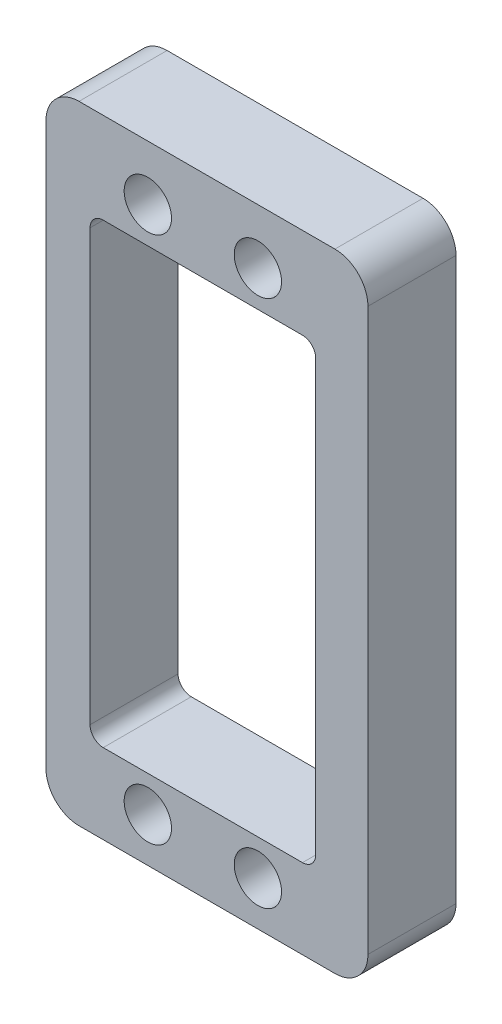
ISO-10303-21;
HEADER;
FILE_DESCRIPTION(('STEP AP214'),'2;1');
FILE_NAME('part.step','',(''),(''),'','','');
FILE_SCHEMA(('AUTOMOTIVE_DESIGN { 1 0 10303 214 1 1 1 1 }'));
ENDSEC;
DATA;
#1=APPLICATION_CONTEXT('core data for automotive mechanical design processes');
#2=APPLICATION_PROTOCOL_DEFINITION('international standard','automotive_design',2000,#1);
#3=PRODUCT_CONTEXT('',#1,'mechanical');
#4=PRODUCT('Part','Part','',(#3));
#5=PRODUCT_RELATED_PRODUCT_CATEGORY('part','',(#4));
#6=PRODUCT_DEFINITION_FORMATION('','',#4);
#7=PRODUCT_DEFINITION_CONTEXT('part definition',#1,'design');
#8=PRODUCT_DEFINITION('design','',#6,#7);
#9=PRODUCT_DEFINITION_SHAPE('','',#8);
#10=(LENGTH_UNIT() NAMED_UNIT(*) SI_UNIT(.MILLI.,.METRE.));
#11=(NAMED_UNIT(*) PLANE_ANGLE_UNIT() SI_UNIT($,.RADIAN.));
#12=(NAMED_UNIT(*) SI_UNIT($,.STERADIAN.) SOLID_ANGLE_UNIT());
#13=UNCERTAINTY_MEASURE_WITH_UNIT(LENGTH_MEASURE(1.E-05),#10,'distance_accuracy_value','');
#14=(GEOMETRIC_REPRESENTATION_CONTEXT(3) GLOBAL_UNCERTAINTY_ASSIGNED_CONTEXT((#13)) GLOBAL_UNIT_ASSIGNED_CONTEXT((#10,
#11,#12)) REPRESENTATION_CONTEXT('',''));
#15=CARTESIAN_POINT('',(0.,0.,0.));
#16=DIRECTION('',(0.,0.,1.));
#17=DIRECTION('',(1.,0.,0.));
#18=AXIS2_PLACEMENT_3D('',#15,#16,#17);
#19=CARTESIAN_POINT('',(0.,0.,8.));
#20=DIRECTION('',(0.,0.,1.));
#21=DIRECTION('',(1.,0.,0.));
#22=AXIS2_PLACEMENT_3D('',#19,#20,#21);
#23=PLANE('',#22);
#24=CARTESIAN_POINT('',(80.0000000000001,-4.99999999999999,8.));
#25=DIRECTION('',(0.,0.,1.));
#26=DIRECTION('',(1.,0.,0.));
#27=AXIS2_PLACEMENT_3D('',#24,#25,#26);
#28=CIRCLE('',#27,2.15);
#29=CARTESIAN_POINT('',(82.1500000000001,-4.99999999999999,8.));
#30=VERTEX_POINT('',#29);
#31=EDGE_CURVE('E202',#30,#30,#28,.T.);
#32=ORIENTED_EDGE('',*,*,#31,.F.);
#33=EDGE_LOOP('',(#32));
#34=FACE_BOUND('',#33,.T.);
#35=CARTESIAN_POINT('',(90.0000000000001,-53.,8.));
#36=DIRECTION('',(0.,0.,1.));
#37=DIRECTION('',(1.,0.,0.));
#38=AXIS2_PLACEMENT_3D('',#35,#36,#37);
#39=CIRCLE('',#38,2.15);
#40=CARTESIAN_POINT('',(92.15,-53.,8.));
#41=VERTEX_POINT('',#40);
#42=EDGE_CURVE('E190',#41,#41,#39,.T.);
#43=ORIENTED_EDGE('',*,*,#42,.F.);
#44=EDGE_LOOP('',(#43));
#45=FACE_BOUND('',#44,.T.);
#46=CARTESIAN_POINT('',(80.0000000000001,-53.,8.));
#47=DIRECTION('',(0.,0.,1.));
#48=DIRECTION('',(1.,0.,0.));
#49=AXIS2_PLACEMENT_3D('',#46,#47,#48);
#50=CIRCLE('',#49,2.15);
#51=CARTESIAN_POINT('',(82.1500000000001,-53.,8.));
#52=VERTEX_POINT('',#51);
#53=EDGE_CURVE('E206',#52,#52,#50,.T.);
#54=ORIENTED_EDGE('',*,*,#53,.F.);
#55=EDGE_LOOP('',(#54));
#56=FACE_BOUND('',#55,.T.);
#57=CARTESIAN_POINT('',(90.0000000000001,-4.99999999999999,8.));
#58=DIRECTION('',(0.,0.,1.));
#59=DIRECTION('',(1.,0.,0.));
#60=AXIS2_PLACEMENT_3D('',#57,#58,#59);
#61=CIRCLE('',#60,2.15);
#62=CARTESIAN_POINT('',(92.15,-4.99999999999999,8.));
#63=VERTEX_POINT('',#62);
#64=EDGE_CURVE('E199',#63,#63,#61,.T.);
#65=ORIENTED_EDGE('',*,*,#64,.F.);
#66=EDGE_LOOP('',(#65));
#67=FACE_BOUND('',#66,.T.);
#68=DIRECTION('',(1.,0.,0.));
#69=VECTOR('',#68,1.);
#70=CARTESIAN_POINT('',(74.7500000000001,-49.75,8.));
#71=LINE('',#70,#69);
#72=CARTESIAN_POINT('',(75.9500000000001,-49.75,8.));
#73=VERTEX_POINT('',#72);
#74=CARTESIAN_POINT('',(94.0500000000001,-49.75,8.));
#75=VERTEX_POINT('',#74);
#76=EDGE_CURVE('E327',#73,#75,#71,.T.);
#77=ORIENTED_EDGE('',*,*,#76,.F.);
#78=CARTESIAN_POINT('',(75.9500000000001,-48.55,8.));
#79=DIRECTION('',(0.,0.,1.));
#80=DIRECTION('',(1.,0.,0.));
#81=AXIS2_PLACEMENT_3D('',#78,#79,#80);
#82=CIRCLE('',#81,1.2);
#83=CARTESIAN_POINT('',(74.7500000000001,-48.55,8.));
#84=VERTEX_POINT('',#83);
#85=EDGE_CURVE('E185',#73,#84,#82,.F.);
#86=ORIENTED_EDGE('',*,*,#85,.T.);
#87=DIRECTION('',(0.,-1.,0.));
#88=VECTOR('',#87,1.);
#89=CARTESIAN_POINT('',(74.7500000000001,-8.24999999999999,8.));
#90=LINE('',#89,#88);
#91=CARTESIAN_POINT('',(74.7500000000001,-9.44999999999999,8.));
#92=VERTEX_POINT('',#91);
#93=EDGE_CURVE('E176',#92,#84,#90,.T.);
#94=ORIENTED_EDGE('',*,*,#93,.F.);
#95=CARTESIAN_POINT('',(75.9500000000001,-9.44999999999999,8.));
#96=DIRECTION('',(0.,0.,1.));
#97=DIRECTION('',(1.,0.,0.));
#98=AXIS2_PLACEMENT_3D('',#95,#96,#97);
#99=CIRCLE('',#98,1.2);
#100=CARTESIAN_POINT('',(75.9500000000001,-8.24999999999999,8.));
#101=VERTEX_POINT('',#100);
#102=EDGE_CURVE('E159',#92,#101,#99,.F.);
#103=ORIENTED_EDGE('',*,*,#102,.T.);
#104=DIRECTION('',(1.,0.,0.));
#105=VECTOR('',#104,1.);
#106=CARTESIAN_POINT('',(74.7500000000001,-8.24999999999999,8.));
#107=LINE('',#106,#105);
#108=CARTESIAN_POINT('',(94.0500000000001,-8.24999999999999,8.));
#109=VERTEX_POINT('',#108);
#110=EDGE_CURVE('E187',#101,#109,#107,.T.);
#111=ORIENTED_EDGE('',*,*,#110,.T.);
#112=CARTESIAN_POINT('',(94.0500000000001,-9.44999999999999,8.));
#113=DIRECTION('',(0.,0.,1.));
#114=DIRECTION('',(1.,0.,0.));
#115=AXIS2_PLACEMENT_3D('',#112,#113,#114);
#116=CIRCLE('',#115,1.2);
#117=CARTESIAN_POINT('',(95.2500000000001,-9.44999999999999,8.));
#118=VERTEX_POINT('',#117);
#119=EDGE_CURVE('E257',#109,#118,#116,.F.);
#120=ORIENTED_EDGE('',*,*,#119,.T.);
#121=DIRECTION('',(0.,-1.,0.));
#122=VECTOR('',#121,1.);
#123=CARTESIAN_POINT('',(95.2500000000001,-8.24999999999999,8.));
#124=LINE('',#123,#122);
#125=CARTESIAN_POINT('',(95.2500000000001,-48.55,8.));
#126=VERTEX_POINT('',#125);
#127=EDGE_CURVE('E192',#118,#126,#124,.T.);
#128=ORIENTED_EDGE('',*,*,#127,.T.);
#129=CARTESIAN_POINT('',(94.0500000000001,-48.55,8.));
#130=DIRECTION('',(0.,0.,1.));
#131=DIRECTION('',(1.,0.,0.));
#132=AXIS2_PLACEMENT_3D('',#129,#130,#131);
#133=CIRCLE('',#132,1.2);
#134=EDGE_CURVE('E250',#126,#75,#133,.F.);
#135=ORIENTED_EDGE('',*,*,#134,.T.);
#136=EDGE_LOOP('',(#77,#86,#94,#103,#111,#120,#128,#135));
#137=FACE_BOUND('',#136,.T.);
#138=DIRECTION('',(1.,0.,0.));
#139=VECTOR('',#138,1.);
#140=CARTESIAN_POINT('',(0.,-57.,8.));
#141=LINE('',#140,#139);
#142=CARTESIAN_POINT('',(73.7500000000001,-57.,8.));
#143=VERTEX_POINT('',#142);
#144=CARTESIAN_POINT('',(97.,-57.,8.));
#145=VERTEX_POINT('',#144);
#146=EDGE_CURVE('E305',#143,#145,#141,.T.);
#147=ORIENTED_EDGE('',*,*,#146,.T.);
#148=CARTESIAN_POINT('',(97.,-54.,8.));
#149=DIRECTION('',(0.,0.,1.));
#150=DIRECTION('',(1.,0.,0.));
#151=AXIS2_PLACEMENT_3D('',#148,#149,#150);
#152=CIRCLE('',#151,3.);
#153=CARTESIAN_POINT('',(100.,-54.,8.));
#154=VERTEX_POINT('',#153);
#155=EDGE_CURVE('E290',#145,#154,#152,.T.);
#156=ORIENTED_EDGE('',*,*,#155,.T.);
#157=DIRECTION('',(0.,1.,0.));
#158=VECTOR('',#157,1.);
#159=CARTESIAN_POINT('',(100.,0.,8.));
#160=LINE('',#159,#158);
#161=CARTESIAN_POINT('',(100.,-3.,8.));
#162=VERTEX_POINT('',#161);
#163=EDGE_CURVE('E217',#154,#162,#160,.T.);
#164=ORIENTED_EDGE('',*,*,#163,.T.);
#165=CARTESIAN_POINT('',(97.,-3.,8.));
#166=DIRECTION('',(0.,0.,1.));
#167=DIRECTION('',(1.,0.,0.));
#168=AXIS2_PLACEMENT_3D('',#165,#166,#167);
#169=CIRCLE('',#168,3.);
#170=CARTESIAN_POINT('',(97.,0.,8.));
#171=VERTEX_POINT('',#170);
#172=EDGE_CURVE('E264',#162,#171,#169,.T.);
#173=ORIENTED_EDGE('',*,*,#172,.T.);
#174=DIRECTION('',(-1.,0.,0.));
#175=VECTOR('',#174,1.);
#176=CARTESIAN_POINT('',(0.,0.,8.));
#177=LINE('',#176,#175);
#178=CARTESIAN_POINT('',(73.7500000000001,0.,8.));
#179=VERTEX_POINT('',#178);
#180=EDGE_CURVE('E219',#171,#179,#177,.T.);
#181=ORIENTED_EDGE('',*,*,#180,.T.);
#182=CARTESIAN_POINT('',(73.7500000000001,-3.,8.));
#183=DIRECTION('',(0.,0.,1.));
#184=DIRECTION('',(1.,0.,0.));
#185=AXIS2_PLACEMENT_3D('',#182,#183,#184);
#186=CIRCLE('',#185,3.);
#187=CARTESIAN_POINT('',(70.75,-3.,8.));
#188=VERTEX_POINT('',#187);
#189=EDGE_CURVE('E261',#179,#188,#186,.T.);
#190=ORIENTED_EDGE('',*,*,#189,.T.);
#191=DIRECTION('',(0.,1.,0.));
#192=VECTOR('',#191,1.);
#193=CARTESIAN_POINT('',(70.75,0.,8.));
#194=LINE('',#193,#192);
#195=CARTESIAN_POINT('',(70.75,-54.,8.));
#196=VERTEX_POINT('',#195);
#197=EDGE_CURVE('E304',#196,#188,#194,.T.);
#198=ORIENTED_EDGE('',*,*,#197,.F.);
#199=CARTESIAN_POINT('',(73.7500000000001,-54.,8.));
#200=DIRECTION('',(0.,0.,1.));
#201=DIRECTION('',(1.,0.,0.));
#202=AXIS2_PLACEMENT_3D('',#199,#200,#201);
#203=CIRCLE('',#202,3.);
#204=EDGE_CURVE('E288',#196,#143,#203,.T.);
#205=ORIENTED_EDGE('',*,*,#204,.T.);
#206=EDGE_LOOP('',(#147,#156,#164,#173,#181,#190,#198,#205));
#207=FACE_BOUND('',#206,.T.);
#208=ADVANCED_FACE('F44',(#34,#45,#56,#67,#137,#207),#23,.T.);
#209=CARTESIAN_POINT('',(0.,0.,0.));
#210=DIRECTION('',(0.,0.,1.));
#211=DIRECTION('',(1.,0.,0.));
#212=AXIS2_PLACEMENT_3D('',#209,#210,#211);
#213=PLANE('',#212);
#214=CARTESIAN_POINT('',(80.0000000000001,-4.99999999999999,0.));
#215=DIRECTION('',(0.,0.,1.));
#216=DIRECTION('',(1.,0.,0.));
#217=AXIS2_PLACEMENT_3D('',#214,#215,#216);
#218=CIRCLE('',#217,2.15);
#219=CARTESIAN_POINT('',(82.1500000000001,-4.99999999999999,0.));
#220=VERTEX_POINT('',#219);
#221=EDGE_CURVE('E211',#220,#220,#218,.T.);
#222=ORIENTED_EDGE('',*,*,#221,.T.);
#223=EDGE_LOOP('',(#222));
#224=FACE_BOUND('',#223,.T.);
#225=CARTESIAN_POINT('',(90.0000000000001,-53.,0.));
#226=DIRECTION('',(0.,0.,1.));
#227=DIRECTION('',(1.,0.,0.));
#228=AXIS2_PLACEMENT_3D('',#225,#226,#227);
#229=CIRCLE('',#228,2.15);
#230=CARTESIAN_POINT('',(92.15,-53.,0.));
#231=VERTEX_POINT('',#230);
#232=EDGE_CURVE('E186',#231,#231,#229,.T.);
#233=ORIENTED_EDGE('',*,*,#232,.T.);
#234=EDGE_LOOP('',(#233));
#235=FACE_BOUND('',#234,.T.);
#236=CARTESIAN_POINT('',(80.0000000000001,-53.,0.));
#237=DIRECTION('',(0.,0.,1.));
#238=DIRECTION('',(1.,0.,0.));
#239=AXIS2_PLACEMENT_3D('',#236,#237,#238);
#240=CIRCLE('',#239,2.15);
#241=CARTESIAN_POINT('',(82.1500000000001,-53.,0.));
#242=VERTEX_POINT('',#241);
#243=EDGE_CURVE('E197',#242,#242,#240,.T.);
#244=ORIENTED_EDGE('',*,*,#243,.T.);
#245=EDGE_LOOP('',(#244));
#246=FACE_BOUND('',#245,.T.);
#247=CARTESIAN_POINT('',(90.0000000000001,-4.99999999999999,0.));
#248=DIRECTION('',(0.,0.,1.));
#249=DIRECTION('',(1.,0.,0.));
#250=AXIS2_PLACEMENT_3D('',#247,#248,#249);
#251=CIRCLE('',#250,2.15);
#252=CARTESIAN_POINT('',(92.15,-4.99999999999999,0.));
#253=VERTEX_POINT('',#252);
#254=EDGE_CURVE('E203',#253,#253,#251,.T.);
#255=ORIENTED_EDGE('',*,*,#254,.T.);
#256=EDGE_LOOP('',(#255));
#257=FACE_BOUND('',#256,.T.);
#258=DIRECTION('',(1.,0.,0.));
#259=VECTOR('',#258,1.);
#260=CARTESIAN_POINT('',(0.,-8.24999999999999,0.));
#261=LINE('',#260,#259);
#262=CARTESIAN_POINT('',(75.9500000000001,-8.24999999999999,0.));
#263=VERTEX_POINT('',#262);
#264=CARTESIAN_POINT('',(94.0500000000001,-8.24999999999999,0.));
#265=VERTEX_POINT('',#264);
#266=EDGE_CURVE('E229',#263,#265,#261,.T.);
#267=ORIENTED_EDGE('',*,*,#266,.F.);
#268=CARTESIAN_POINT('',(75.9500000000001,-9.44999999999999,0.));
#269=DIRECTION('',(0.,0.,1.));
#270=DIRECTION('',(1.,0.,0.));
#271=AXIS2_PLACEMENT_3D('',#268,#269,#270);
#272=CIRCLE('',#271,1.2);
#273=CARTESIAN_POINT('',(74.7500000000001,-9.44999999999999,0.));
#274=VERTEX_POINT('',#273);
#275=EDGE_CURVE('E169',#263,#274,#272,.T.);
#276=ORIENTED_EDGE('',*,*,#275,.T.);
#277=DIRECTION('',(0.,-1.,0.));
#278=VECTOR('',#277,1.);
#279=CARTESIAN_POINT('',(74.7500000000001,0.,0.));
#280=LINE('',#279,#278);
#281=CARTESIAN_POINT('',(74.7500000000001,-48.55,0.));
#282=VERTEX_POINT('',#281);
#283=EDGE_CURVE('E179',#274,#282,#280,.T.);
#284=ORIENTED_EDGE('',*,*,#283,.T.);
#285=CARTESIAN_POINT('',(75.9500000000001,-48.55,0.));
#286=DIRECTION('',(0.,0.,1.));
#287=DIRECTION('',(1.,0.,0.));
#288=AXIS2_PLACEMENT_3D('',#285,#286,#287);
#289=CIRCLE('',#288,1.2);
#290=CARTESIAN_POINT('',(75.9500000000001,-49.75,0.));
#291=VERTEX_POINT('',#290);
#292=EDGE_CURVE('E255',#282,#291,#289,.T.);
#293=ORIENTED_EDGE('',*,*,#292,.T.);
#294=DIRECTION('',(1.,0.,0.));
#295=VECTOR('',#294,1.);
#296=CARTESIAN_POINT('',(0.,-49.75,0.));
#297=LINE('',#296,#295);
#298=CARTESIAN_POINT('',(94.0500000000001,-49.75,0.));
#299=VERTEX_POINT('',#298);
#300=EDGE_CURVE('E233',#291,#299,#297,.T.);
#301=ORIENTED_EDGE('',*,*,#300,.T.);
#302=CARTESIAN_POINT('',(94.0500000000001,-48.55,0.));
#303=DIRECTION('',(0.,0.,1.));
#304=DIRECTION('',(1.,0.,0.));
#305=AXIS2_PLACEMENT_3D('',#302,#303,#304);
#306=CIRCLE('',#305,1.2);
#307=CARTESIAN_POINT('',(95.2500000000001,-48.55,0.));
#308=VERTEX_POINT('',#307);
#309=EDGE_CURVE('E252',#299,#308,#306,.T.);
#310=ORIENTED_EDGE('',*,*,#309,.T.);
#311=DIRECTION('',(0.,-1.,0.));
#312=VECTOR('',#311,1.);
#313=CARTESIAN_POINT('',(95.2500000000001,0.,0.));
#314=LINE('',#313,#312);
#315=CARTESIAN_POINT('',(95.2500000000001,-9.44999999999999,0.));
#316=VERTEX_POINT('',#315);
#317=EDGE_CURVE('E223',#316,#308,#314,.T.);
#318=ORIENTED_EDGE('',*,*,#317,.F.);
#319=CARTESIAN_POINT('',(94.0500000000001,-9.44999999999999,0.));
#320=DIRECTION('',(0.,0.,1.));
#321=DIRECTION('',(1.,0.,0.));
#322=AXIS2_PLACEMENT_3D('',#319,#320,#321);
#323=CIRCLE('',#322,1.2);
#324=EDGE_CURVE('E259',#316,#265,#323,.T.);
#325=ORIENTED_EDGE('',*,*,#324,.T.);
#326=EDGE_LOOP('',(#267,#276,#284,#293,#301,#310,#318,#325));
#327=FACE_BOUND('',#326,.T.);
#328=DIRECTION('',(0.,1.,0.));
#329=VECTOR('',#328,1.);
#330=CARTESIAN_POINT('',(100.,0.,0.));
#331=LINE('',#330,#329);
#332=CARTESIAN_POINT('',(100.,-54.,0.));
#333=VERTEX_POINT('',#332);
#334=CARTESIAN_POINT('',(100.,-3.,0.));
#335=VERTEX_POINT('',#334);
#336=EDGE_CURVE('E214',#333,#335,#331,.T.);
#337=ORIENTED_EDGE('',*,*,#336,.F.);
#338=CARTESIAN_POINT('',(97.,-54.,0.));
#339=DIRECTION('',(0.,0.,1.));
#340=DIRECTION('',(1.,0.,0.));
#341=AXIS2_PLACEMENT_3D('',#338,#339,#340);
#342=CIRCLE('',#341,3.);
#343=CARTESIAN_POINT('',(97.,-57.,0.));
#344=VERTEX_POINT('',#343);
#345=EDGE_CURVE('E52',#333,#344,#342,.F.);
#346=ORIENTED_EDGE('',*,*,#345,.T.);
#347=DIRECTION('',(1.,0.,0.));
#348=VECTOR('',#347,1.);
#349=CARTESIAN_POINT('',(0.,-57.,0.));
#350=LINE('',#349,#348);
#351=CARTESIAN_POINT('',(73.7500000000001,-57.,0.));
#352=VERTEX_POINT('',#351);
#353=EDGE_CURVE('E296',#352,#344,#350,.T.);
#354=ORIENTED_EDGE('',*,*,#353,.F.);
#355=CARTESIAN_POINT('',(73.7500000000001,-54.,0.));
#356=DIRECTION('',(0.,0.,1.));
#357=DIRECTION('',(1.,0.,0.));
#358=AXIS2_PLACEMENT_3D('',#355,#356,#357);
#359=CIRCLE('',#358,3.);
#360=CARTESIAN_POINT('',(70.75,-54.,0.));
#361=VERTEX_POINT('',#360);
#362=EDGE_CURVE('E59',#352,#361,#359,.F.);
#363=ORIENTED_EDGE('',*,*,#362,.T.);
#364=DIRECTION('',(0.,1.,0.));
#365=VECTOR('',#364,1.);
#366=CARTESIAN_POINT('',(70.75,0.,0.));
#367=LINE('',#366,#365);
#368=CARTESIAN_POINT('',(70.75,-3.,0.));
#369=VERTEX_POINT('',#368);
#370=EDGE_CURVE('E325',#361,#369,#367,.T.);
#371=ORIENTED_EDGE('',*,*,#370,.T.);
#372=CARTESIAN_POINT('',(73.7500000000001,-3.,0.));
#373=DIRECTION('',(0.,0.,1.));
#374=DIRECTION('',(1.,0.,0.));
#375=AXIS2_PLACEMENT_3D('',#372,#373,#374);
#376=CIRCLE('',#375,3.);
#377=CARTESIAN_POINT('',(73.7500000000001,0.,0.));
#378=VERTEX_POINT('',#377);
#379=EDGE_CURVE('E266',#369,#378,#376,.F.);
#380=ORIENTED_EDGE('',*,*,#379,.T.);
#381=DIRECTION('',(-1.,0.,0.));
#382=VECTOR('',#381,1.);
#383=CARTESIAN_POINT('',(0.,0.,0.));
#384=LINE('',#383,#382);
#385=CARTESIAN_POINT('',(97.,0.,0.));
#386=VERTEX_POINT('',#385);
#387=EDGE_CURVE('E220',#386,#378,#384,.T.);
#388=ORIENTED_EDGE('',*,*,#387,.F.);
#389=CARTESIAN_POINT('',(97.,-3.,0.));
#390=DIRECTION('',(0.,0.,1.));
#391=DIRECTION('',(1.,0.,0.));
#392=AXIS2_PLACEMENT_3D('',#389,#390,#391);
#393=CIRCLE('',#392,3.);
#394=EDGE_CURVE('E268',#386,#335,#393,.F.);
#395=ORIENTED_EDGE('',*,*,#394,.T.);
#396=EDGE_LOOP('',(#337,#346,#354,#363,#371,#380,#388,#395));
#397=FACE_BOUND('',#396,.T.);
#398=ADVANCED_FACE('F295',(#224,#235,#246,#257,#327,#397),#213,.F.);
#399=CARTESIAN_POINT('',(100.,0.,8.));
#400=DIRECTION('',(-1.,0.,0.));
#401=DIRECTION('',(0.,-1.,0.));
#402=AXIS2_PLACEMENT_3D('',#399,#400,#401);
#403=PLANE('',#402);
#404=ORIENTED_EDGE('',*,*,#163,.F.);
#405=DIRECTION('',(0.,0.,1.));
#406=VECTOR('',#405,1.);
#407=CARTESIAN_POINT('',(100.,-54.,0.));
#408=LINE('',#407,#406);
#409=EDGE_CURVE('E67',#154,#333,#408,.F.);
#410=ORIENTED_EDGE('',*,*,#409,.T.);
#411=ORIENTED_EDGE('',*,*,#336,.T.);
#412=DIRECTION('',(0.,0.,-1.));
#413=VECTOR('',#412,1.);
#414=CARTESIAN_POINT('',(100.,-3.,8.));
#415=LINE('',#414,#413);
#416=EDGE_CURVE('E271',#335,#162,#415,.F.);
#417=ORIENTED_EDGE('',*,*,#416,.T.);
#418=EDGE_LOOP('',(#404,#410,#411,#417));
#419=FACE_BOUND('',#418,.T.);
#420=ADVANCED_FACE('F308',(#419),#403,.F.);
#421=CARTESIAN_POINT('',(70.75,0.,0.));
#422=DIRECTION('',(1.,0.,0.));
#423=DIRECTION('',(0.,0.,-1.));
#424=AXIS2_PLACEMENT_3D('',#421,#422,#423);
#425=PLANE('',#424);
#426=ORIENTED_EDGE('',*,*,#370,.F.);
#427=DIRECTION('',(0.,0.,1.));
#428=VECTOR('',#427,1.);
#429=CARTESIAN_POINT('',(70.75,-54.,8.));
#430=LINE('',#429,#428);
#431=EDGE_CURVE('E11',#361,#196,#430,.T.);
#432=ORIENTED_EDGE('',*,*,#431,.T.);
#433=ORIENTED_EDGE('',*,*,#197,.T.);
#434=DIRECTION('',(0.,0.,1.));
#435=VECTOR('',#434,1.);
#436=CARTESIAN_POINT('',(70.75,-3.,0.));
#437=LINE('',#436,#435);
#438=EDGE_CURVE('E280',#188,#369,#437,.F.);
#439=ORIENTED_EDGE('',*,*,#438,.T.);
#440=EDGE_LOOP('',(#426,#432,#433,#439));
#441=FACE_BOUND('',#440,.T.);
#442=ADVANCED_FACE('F372',(#441),#425,.F.);
#443=CARTESIAN_POINT('',(0.,0.,8.));
#444=DIRECTION('',(0.,-1.,0.));
#445=DIRECTION('',(0.,0.,-1.));
#446=AXIS2_PLACEMENT_3D('',#443,#444,#445);
#447=PLANE('',#446);
#448=ORIENTED_EDGE('',*,*,#180,.F.);
#449=DIRECTION('',(0.,0.,-1.));
#450=VECTOR('',#449,1.);
#451=CARTESIAN_POINT('',(97.,0.,8.));
#452=LINE('',#451,#450);
#453=EDGE_CURVE('E277',#171,#386,#452,.T.);
#454=ORIENTED_EDGE('',*,*,#453,.T.);
#455=ORIENTED_EDGE('',*,*,#387,.T.);
#456=DIRECTION('',(0.,0.,1.));
#457=VECTOR('',#456,1.);
#458=CARTESIAN_POINT('',(73.7500000000001,0.,8.));
#459=LINE('',#458,#457);
#460=EDGE_CURVE('E274',#378,#179,#459,.T.);
#461=ORIENTED_EDGE('',*,*,#460,.T.);
#462=EDGE_LOOP('',(#448,#454,#455,#461));
#463=FACE_BOUND('',#462,.T.);
#464=ADVANCED_FACE('F316',(#463),#447,.F.);
#465=CARTESIAN_POINT('',(80.0000000000001,-4.99999999999999,0.));
#466=DIRECTION('',(0.,0.,1.));
#467=DIRECTION('',(1.,0.,0.));
#468=AXIS2_PLACEMENT_3D('',#465,#466,#467);
#469=CYLINDRICAL_SURFACE('',#468,2.15);
#470=ORIENTED_EDGE('',*,*,#221,.F.);
#471=EDGE_LOOP('',(#470));
#472=FACE_BOUND('',#471,.T.);
#473=ORIENTED_EDGE('',*,*,#31,.T.);
#474=EDGE_LOOP('',(#473));
#475=FACE_BOUND('',#474,.T.);
#476=ADVANCED_FACE('F367',(#472,#475),#469,.F.);
#477=CARTESIAN_POINT('',(90.0000000000001,-53.,0.));
#478=DIRECTION('',(0.,0.,1.));
#479=DIRECTION('',(1.,0.,0.));
#480=AXIS2_PLACEMENT_3D('',#477,#478,#479);
#481=CYLINDRICAL_SURFACE('',#480,2.15);
#482=ORIENTED_EDGE('',*,*,#232,.F.);
#483=EDGE_LOOP('',(#482));
#484=FACE_BOUND('',#483,.T.);
#485=ORIENTED_EDGE('',*,*,#42,.T.);
#486=EDGE_LOOP('',(#485));
#487=FACE_BOUND('',#486,.T.);
#488=ADVANCED_FACE('F418',(#484,#487),#481,.F.);
#489=CARTESIAN_POINT('',(80.0000000000001,-53.,0.));
#490=DIRECTION('',(0.,0.,1.));
#491=DIRECTION('',(1.,0.,0.));
#492=AXIS2_PLACEMENT_3D('',#489,#490,#491);
#493=CYLINDRICAL_SURFACE('',#492,2.15);
#494=ORIENTED_EDGE('',*,*,#243,.F.);
#495=EDGE_LOOP('',(#494));
#496=FACE_BOUND('',#495,.T.);
#497=ORIENTED_EDGE('',*,*,#53,.T.);
#498=EDGE_LOOP('',(#497));
#499=FACE_BOUND('',#498,.T.);
#500=ADVANCED_FACE('F425',(#496,#499),#493,.F.);
#501=CARTESIAN_POINT('',(90.0000000000001,-4.99999999999999,0.));
#502=DIRECTION('',(0.,0.,1.));
#503=DIRECTION('',(1.,0.,0.));
#504=AXIS2_PLACEMENT_3D('',#501,#502,#503);
#505=CYLINDRICAL_SURFACE('',#504,2.15);
#506=ORIENTED_EDGE('',*,*,#254,.F.);
#507=EDGE_LOOP('',(#506));
#508=FACE_BOUND('',#507,.T.);
#509=ORIENTED_EDGE('',*,*,#64,.T.);
#510=EDGE_LOOP('',(#509));
#511=FACE_BOUND('',#510,.T.);
#512=ADVANCED_FACE('F433',(#508,#511),#505,.F.);
#513=CARTESIAN_POINT('',(74.7500000000001,-49.75,-2.));
#514=DIRECTION('',(0.,-1.,0.));
#515=DIRECTION('',(0.,0.,-1.));
#516=AXIS2_PLACEMENT_3D('',#513,#514,#515);
#517=PLANE('',#516);
#518=ORIENTED_EDGE('',*,*,#76,.T.);
#519=DIRECTION('',(0.,0.,1.));
#520=VECTOR('',#519,1.);
#521=CARTESIAN_POINT('',(94.0500000000001,-49.75,-2.));
#522=LINE('',#521,#520);
#523=EDGE_CURVE('E170',#75,#299,#522,.F.);
#524=ORIENTED_EDGE('',*,*,#523,.T.);
#525=ORIENTED_EDGE('',*,*,#300,.F.);
#526=DIRECTION('',(0.,0.,1.));
#527=VECTOR('',#526,1.);
#528=CARTESIAN_POINT('',(75.9500000000001,-49.75,8.));
#529=LINE('',#528,#527);
#530=EDGE_CURVE('E245',#291,#73,#529,.T.);
#531=ORIENTED_EDGE('',*,*,#530,.T.);
#532=EDGE_LOOP('',(#518,#524,#525,#531));
#533=FACE_BOUND('',#532,.T.);
#534=ADVANCED_FACE('F354',(#533),#517,.F.);
#535=CARTESIAN_POINT('',(74.7500000000001,-8.24999999999999,-2.));
#536=DIRECTION('',(-1.,0.,0.));
#537=DIRECTION('',(0.,0.,1.));
#538=AXIS2_PLACEMENT_3D('',#535,#536,#537);
#539=PLANE('',#538);
#540=ORIENTED_EDGE('',*,*,#283,.F.);
#541=DIRECTION('',(0.,0.,1.));
#542=VECTOR('',#541,1.);
#543=CARTESIAN_POINT('',(74.7500000000001,-9.44999999999999,-2.));
#544=LINE('',#543,#542);
#545=EDGE_CURVE('E163',#274,#92,#544,.T.);
#546=ORIENTED_EDGE('',*,*,#545,.T.);
#547=ORIENTED_EDGE('',*,*,#93,.T.);
#548=DIRECTION('',(0.,0.,1.));
#549=VECTOR('',#548,1.);
#550=CARTESIAN_POINT('',(74.7500000000001,-48.55,0.));
#551=LINE('',#550,#549);
#552=EDGE_CURVE('E181',#84,#282,#551,.F.);
#553=ORIENTED_EDGE('',*,*,#552,.T.);
#554=EDGE_LOOP('',(#540,#546,#547,#553));
#555=FACE_BOUND('',#554,.T.);
#556=ADVANCED_FACE('F175',(#555),#539,.F.);
#557=CARTESIAN_POINT('',(74.7500000000001,-8.24999999999999,-2.));
#558=DIRECTION('',(0.,-1.,0.));
#559=DIRECTION('',(0.,0.,-1.));
#560=AXIS2_PLACEMENT_3D('',#557,#558,#559);
#561=PLANE('',#560);
#562=ORIENTED_EDGE('',*,*,#110,.F.);
#563=DIRECTION('',(0.,0.,1.));
#564=VECTOR('',#563,1.);
#565=CARTESIAN_POINT('',(75.9500000000001,-8.24999999999999,-2.));
#566=LINE('',#565,#564);
#567=EDGE_CURVE('E164',#101,#263,#566,.F.);
#568=ORIENTED_EDGE('',*,*,#567,.T.);
#569=ORIENTED_EDGE('',*,*,#266,.T.);
#570=DIRECTION('',(0.,0.,1.));
#571=VECTOR('',#570,1.);
#572=CARTESIAN_POINT('',(94.0500000000001,-8.24999999999999,8.));
#573=LINE('',#572,#571);
#574=EDGE_CURVE('E180',#265,#109,#573,.T.);
#575=ORIENTED_EDGE('',*,*,#574,.T.);
#576=EDGE_LOOP('',(#562,#568,#569,#575));
#577=FACE_BOUND('',#576,.T.);
#578=ADVANCED_FACE('F346',(#577),#561,.T.);
#579=CARTESIAN_POINT('',(95.2500000000001,-8.24999999999999,-2.));
#580=DIRECTION('',(-1.,0.,0.));
#581=DIRECTION('',(0.,0.,1.));
#582=AXIS2_PLACEMENT_3D('',#579,#580,#581);
#583=PLANE('',#582);
#584=ORIENTED_EDGE('',*,*,#317,.T.);
#585=DIRECTION('',(0.,0.,1.));
#586=VECTOR('',#585,1.);
#587=CARTESIAN_POINT('',(95.2500000000001,-48.55,-2.));
#588=LINE('',#587,#586);
#589=EDGE_CURVE('E242',#308,#126,#588,.T.);
#590=ORIENTED_EDGE('',*,*,#589,.T.);
#591=ORIENTED_EDGE('',*,*,#127,.F.);
#592=DIRECTION('',(0.,0.,1.));
#593=VECTOR('',#592,1.);
#594=CARTESIAN_POINT('',(95.2500000000001,-9.44999999999999,0.));
#595=LINE('',#594,#593);
#596=EDGE_CURVE('E240',#118,#316,#595,.F.);
#597=ORIENTED_EDGE('',*,*,#596,.T.);
#598=EDGE_LOOP('',(#584,#590,#591,#597));
#599=FACE_BOUND('',#598,.T.);
#600=ADVANCED_FACE('F336',(#599),#583,.T.);
#601=CARTESIAN_POINT('',(75.9500000000001,-9.44999999999999,-2.));
#602=DIRECTION('',(0.,0.,1.));
#603=DIRECTION('',(1.,0.,0.));
#604=AXIS2_PLACEMENT_3D('',#601,#602,#603);
#605=CYLINDRICAL_SURFACE('',#604,1.2);
#606=ORIENTED_EDGE('',*,*,#275,.F.);
#607=ORIENTED_EDGE('',*,*,#567,.F.);
#608=ORIENTED_EDGE('',*,*,#102,.F.);
#609=ORIENTED_EDGE('',*,*,#545,.F.);
#610=EDGE_LOOP('',(#606,#607,#608,#609));
#611=FACE_BOUND('',#610,.T.);
#612=ADVANCED_FACE('F162',(#611),#605,.F.);
#613=CARTESIAN_POINT('',(94.0500000000001,-48.55,-2.));
#614=DIRECTION('',(0.,0.,1.));
#615=DIRECTION('',(1.,0.,0.));
#616=AXIS2_PLACEMENT_3D('',#613,#614,#615);
#617=CYLINDRICAL_SURFACE('',#616,1.2);
#618=ORIENTED_EDGE('',*,*,#309,.F.);
#619=ORIENTED_EDGE('',*,*,#523,.F.);
#620=ORIENTED_EDGE('',*,*,#134,.F.);
#621=ORIENTED_EDGE('',*,*,#589,.F.);
#622=EDGE_LOOP('',(#618,#619,#620,#621));
#623=FACE_BOUND('',#622,.T.);
#624=ADVANCED_FACE('F377',(#623),#617,.F.);
#625=CARTESIAN_POINT('',(75.9500000000001,-48.55,-2.));
#626=DIRECTION('',(0.,0.,-1.));
#627=DIRECTION('',(-1.,0.,0.));
#628=AXIS2_PLACEMENT_3D('',#625,#626,#627);
#629=CYLINDRICAL_SURFACE('',#628,1.2);
#630=ORIENTED_EDGE('',*,*,#292,.F.);
#631=ORIENTED_EDGE('',*,*,#552,.F.);
#632=ORIENTED_EDGE('',*,*,#85,.F.);
#633=ORIENTED_EDGE('',*,*,#530,.F.);
#634=EDGE_LOOP('',(#630,#631,#632,#633));
#635=FACE_BOUND('',#634,.T.);
#636=ADVANCED_FACE('F380',(#635),#629,.F.);
#637=CARTESIAN_POINT('',(94.0500000000001,-9.44999999999999,-2.));
#638=DIRECTION('',(0.,0.,-1.));
#639=DIRECTION('',(-1.,0.,0.));
#640=AXIS2_PLACEMENT_3D('',#637,#638,#639);
#641=CYLINDRICAL_SURFACE('',#640,1.2);
#642=ORIENTED_EDGE('',*,*,#324,.F.);
#643=ORIENTED_EDGE('',*,*,#596,.F.);
#644=ORIENTED_EDGE('',*,*,#119,.F.);
#645=ORIENTED_EDGE('',*,*,#574,.F.);
#646=EDGE_LOOP('',(#642,#643,#644,#645));
#647=FACE_BOUND('',#646,.T.);
#648=ADVANCED_FACE('F341',(#647),#641,.F.);
#649=CARTESIAN_POINT('',(97.,-3.,8.));
#650=DIRECTION('',(0.,0.,-1.));
#651=DIRECTION('',(-1.,0.,0.));
#652=AXIS2_PLACEMENT_3D('',#649,#650,#651);
#653=CYLINDRICAL_SURFACE('',#652,3.);
#654=ORIENTED_EDGE('',*,*,#172,.F.);
#655=ORIENTED_EDGE('',*,*,#416,.F.);
#656=ORIENTED_EDGE('',*,*,#394,.F.);
#657=ORIENTED_EDGE('',*,*,#453,.F.);
#658=EDGE_LOOP('',(#654,#655,#656,#657));
#659=FACE_BOUND('',#658,.T.);
#660=ADVANCED_FACE('F313',(#659),#653,.T.);
#661=CARTESIAN_POINT('',(73.7500000000001,-3.,8.));
#662=DIRECTION('',(0.,0.,1.));
#663=DIRECTION('',(1.,0.,0.));
#664=AXIS2_PLACEMENT_3D('',#661,#662,#663);
#665=CYLINDRICAL_SURFACE('',#664,3.);
#666=ORIENTED_EDGE('',*,*,#379,.F.);
#667=ORIENTED_EDGE('',*,*,#438,.F.);
#668=ORIENTED_EDGE('',*,*,#189,.F.);
#669=ORIENTED_EDGE('',*,*,#460,.F.);
#670=EDGE_LOOP('',(#666,#667,#668,#669));
#671=FACE_BOUND('',#670,.T.);
#672=ADVANCED_FACE('F321',(#671),#665,.T.);
#673=CARTESIAN_POINT('',(0.,-57.,0.));
#674=DIRECTION('',(0.,-1.,0.));
#675=DIRECTION('',(0.,0.,-1.));
#676=AXIS2_PLACEMENT_3D('',#673,#674,#675);
#677=PLANE('',#676);
#678=ORIENTED_EDGE('',*,*,#353,.T.);
#679=DIRECTION('',(0.,0.,1.));
#680=VECTOR('',#679,1.);
#681=CARTESIAN_POINT('',(97.,-57.,8.));
#682=LINE('',#681,#680);
#683=EDGE_CURVE('E285',#344,#145,#682,.T.);
#684=ORIENTED_EDGE('',*,*,#683,.T.);
#685=ORIENTED_EDGE('',*,*,#146,.F.);
#686=DIRECTION('',(0.,0.,1.));
#687=VECTOR('',#686,1.);
#688=CARTESIAN_POINT('',(73.7500000000001,-57.,0.));
#689=LINE('',#688,#687);
#690=EDGE_CURVE('E283',#143,#352,#689,.F.);
#691=ORIENTED_EDGE('',*,*,#690,.T.);
#692=EDGE_LOOP('',(#678,#684,#685,#691));
#693=FACE_BOUND('',#692,.T.);
#694=ADVANCED_FACE('F300',(#693),#677,.T.);
#695=CARTESIAN_POINT('',(97.,-54.,0.));
#696=DIRECTION('',(0.,0.,-1.));
#697=DIRECTION('',(-1.,0.,0.));
#698=AXIS2_PLACEMENT_3D('',#695,#696,#697);
#699=CYLINDRICAL_SURFACE('',#698,3.);
#700=ORIENTED_EDGE('',*,*,#345,.F.);
#701=ORIENTED_EDGE('',*,*,#409,.F.);
#702=ORIENTED_EDGE('',*,*,#155,.F.);
#703=ORIENTED_EDGE('',*,*,#683,.F.);
#704=EDGE_LOOP('',(#700,#701,#702,#703));
#705=FACE_BOUND('',#704,.T.);
#706=ADVANCED_FACE('F307',(#705),#699,.T.);
#707=CARTESIAN_POINT('',(73.7500000000001,-54.,0.));
#708=DIRECTION('',(0.,0.,-1.));
#709=DIRECTION('',(-1.,0.,0.));
#710=AXIS2_PLACEMENT_3D('',#707,#708,#709);
#711=CYLINDRICAL_SURFACE('',#710,3.);
#712=ORIENTED_EDGE('',*,*,#362,.F.);
#713=ORIENTED_EDGE('',*,*,#690,.F.);
#714=ORIENTED_EDGE('',*,*,#204,.F.);
#715=ORIENTED_EDGE('',*,*,#431,.F.);
#716=EDGE_LOOP('',(#712,#713,#714,#715));
#717=FACE_BOUND('',#716,.T.);
#718=ADVANCED_FACE('F46',(#717),#711,.T.);
#719=CLOSED_SHELL('',(#208,#398,#420,#442,#464,#476,#488,#500,#512,#534,#556,#578,#600,#612,
#624,#636,#648,#660,#672,#694,#706,#718));
#720=MANIFOLD_SOLID_BREP('B2',#719);
#721=ADVANCED_BREP_SHAPE_REPRESENTATION('',(#18,#720),#14);
#722=SHAPE_DEFINITION_REPRESENTATION(#9,#721);
ENDSEC;
END-ISO-10303-21;
